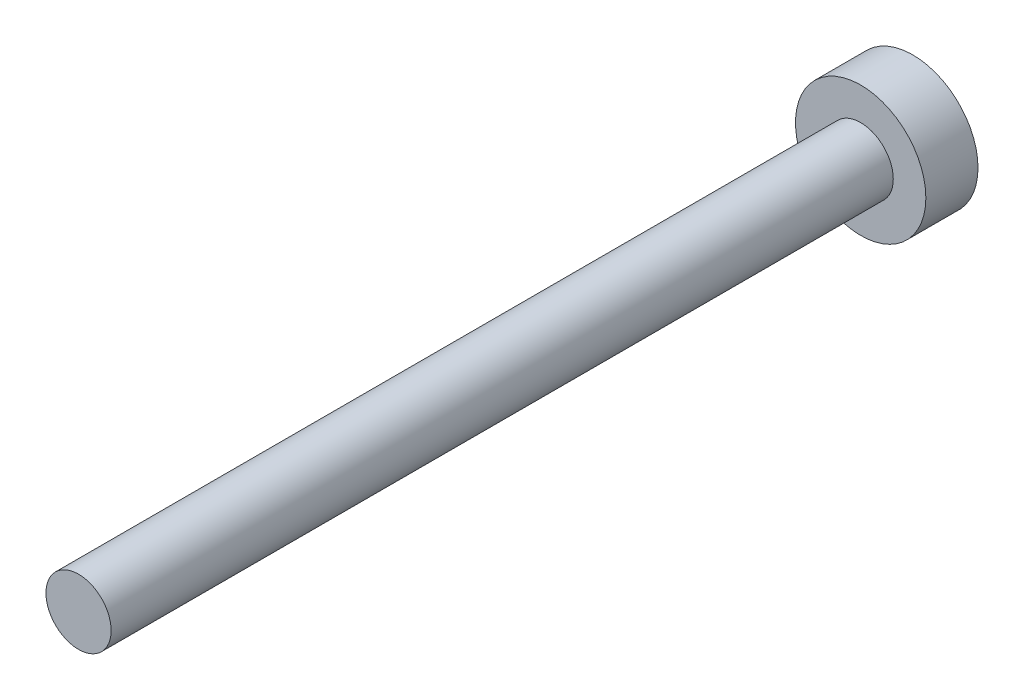
ISO-10303-21;
HEADER;
FILE_DESCRIPTION(('STEP AP214'),'2;1');
FILE_NAME('part.step','',(''),(''),'','','');
FILE_SCHEMA(('AUTOMOTIVE_DESIGN { 1 0 10303 214 1 1 1 1 }'));
ENDSEC;
DATA;
#1=APPLICATION_CONTEXT('core data for automotive mechanical design processes');
#2=APPLICATION_PROTOCOL_DEFINITION('international standard','automotive_design',2000,#1);
#3=PRODUCT_CONTEXT('',#1,'mechanical');
#4=PRODUCT('Part','Part','',(#3));
#5=PRODUCT_RELATED_PRODUCT_CATEGORY('part','',(#4));
#6=PRODUCT_DEFINITION_FORMATION('','',#4);
#7=PRODUCT_DEFINITION_CONTEXT('part definition',#1,'design');
#8=PRODUCT_DEFINITION('design','',#6,#7);
#9=PRODUCT_DEFINITION_SHAPE('','',#8);
#10=(LENGTH_UNIT() NAMED_UNIT(*) SI_UNIT(.MILLI.,.METRE.));
#11=(NAMED_UNIT(*) PLANE_ANGLE_UNIT() SI_UNIT($,.RADIAN.));
#12=(NAMED_UNIT(*) SI_UNIT($,.STERADIAN.) SOLID_ANGLE_UNIT());
#13=UNCERTAINTY_MEASURE_WITH_UNIT(LENGTH_MEASURE(1.E-05),#10,'distance_accuracy_value','');
#14=(GEOMETRIC_REPRESENTATION_CONTEXT(3) GLOBAL_UNCERTAINTY_ASSIGNED_CONTEXT((#13)) GLOBAL_UNIT_ASSIGNED_CONTEXT((#10,
#11,#12)) REPRESENTATION_CONTEXT('',''));
#15=CARTESIAN_POINT('',(0.,0.,0.));
#16=DIRECTION('',(0.,0.,1.));
#17=DIRECTION('',(1.,0.,0.));
#18=AXIS2_PLACEMENT_3D('',#15,#16,#17);
#19=CARTESIAN_POINT('',(0.,0.,6.35));
#20=DIRECTION('',(0.,0.,1.));
#21=DIRECTION('',(1.,0.,0.));
#22=AXIS2_PLACEMENT_3D('',#19,#20,#21);
#23=PLANE('',#22);
#24=CARTESIAN_POINT('',(0.,0.,6.35));
#25=DIRECTION('',(0.,0.,1.));
#26=DIRECTION('',(1.,0.,0.));
#27=AXIS2_PLACEMENT_3D('',#24,#25,#26);
#28=CIRCLE('',#27,7.9375);
#29=CARTESIAN_POINT('',(7.9375,0.,6.35));
#30=VERTEX_POINT('',#29);
#31=EDGE_CURVE('E10',#30,#30,#28,.T.);
#32=ORIENTED_EDGE('',*,*,#31,.T.);
#33=EDGE_LOOP('',(#32));
#34=FACE_BOUND('',#33,.T.);
#35=CARTESIAN_POINT('',(0.,0.,6.35));
#36=DIRECTION('',(0.,0.,1.));
#37=DIRECTION('',(1.,0.,0.));
#38=AXIS2_PLACEMENT_3D('',#35,#36,#37);
#39=CIRCLE('',#38,3.96875);
#40=CARTESIAN_POINT('',(3.96875,0.,6.35));
#41=VERTEX_POINT('',#40);
#42=EDGE_CURVE('E46',#41,#41,#39,.T.);
#43=ORIENTED_EDGE('',*,*,#42,.F.);
#44=EDGE_LOOP('',(#43));
#45=FACE_BOUND('',#44,.T.);
#46=ADVANCED_FACE('F33',(#34,#45),#23,.T.);
#47=CARTESIAN_POINT('',(0.,0.,6.35));
#48=DIRECTION('',(0.,0.,-1.));
#49=DIRECTION('',(-1.,0.,0.));
#50=AXIS2_PLACEMENT_3D('',#47,#48,#49);
#51=CYLINDRICAL_SURFACE('',#50,7.9375);
#52=ORIENTED_EDGE('',*,*,#31,.F.);
#53=EDGE_LOOP('',(#52));
#54=FACE_BOUND('',#53,.T.);
#55=CARTESIAN_POINT('',(0.,0.,0.));
#56=DIRECTION('',(0.,0.,1.));
#57=DIRECTION('',(1.,0.,0.));
#58=AXIS2_PLACEMENT_3D('',#55,#56,#57);
#59=CIRCLE('',#58,7.9375);
#60=CARTESIAN_POINT('',(7.9375,0.,0.));
#61=VERTEX_POINT('',#60);
#62=EDGE_CURVE('E37',#61,#61,#59,.T.);
#63=ORIENTED_EDGE('',*,*,#62,.T.);
#64=EDGE_LOOP('',(#63));
#65=FACE_BOUND('',#64,.T.);
#66=ADVANCED_FACE('F35',(#54,#65),#51,.T.);
#67=CARTESIAN_POINT('',(0.,0.,0.));
#68=DIRECTION('',(0.,0.,1.));
#69=DIRECTION('',(1.,0.,0.));
#70=AXIS2_PLACEMENT_3D('',#67,#68,#69);
#71=PLANE('',#70);
#72=ORIENTED_EDGE('',*,*,#62,.F.);
#73=EDGE_LOOP('',(#72));
#74=FACE_BOUND('',#73,.T.);
#75=ADVANCED_FACE('F57',(#74),#71,.F.);
#76=CARTESIAN_POINT('',(0.,0.,101.6));
#77=DIRECTION('',(0.,0.,-1.));
#78=DIRECTION('',(-1.,0.,0.));
#79=AXIS2_PLACEMENT_3D('',#76,#77,#78);
#80=CYLINDRICAL_SURFACE('',#79,3.96875);
#81=CARTESIAN_POINT('',(0.,0.,101.6));
#82=DIRECTION('',(0.,0.,1.));
#83=DIRECTION('',(1.,0.,0.));
#84=AXIS2_PLACEMENT_3D('',#81,#82,#83);
#85=CIRCLE('',#84,3.96875);
#86=CARTESIAN_POINT('',(3.96875,0.,101.6));
#87=VERTEX_POINT('',#86);
#88=EDGE_CURVE('E44',#87,#87,#85,.T.);
#89=ORIENTED_EDGE('',*,*,#88,.F.);
#90=EDGE_LOOP('',(#89));
#91=FACE_BOUND('',#90,.T.);
#92=ORIENTED_EDGE('',*,*,#42,.T.);
#93=EDGE_LOOP('',(#92));
#94=FACE_BOUND('',#93,.T.);
#95=ADVANCED_FACE('F54',(#91,#94),#80,.T.);
#96=CARTESIAN_POINT('',(0.,0.,101.6));
#97=DIRECTION('',(0.,0.,1.));
#98=DIRECTION('',(1.,0.,0.));
#99=AXIS2_PLACEMENT_3D('',#96,#97,#98);
#100=PLANE('',#99);
#101=ORIENTED_EDGE('',*,*,#88,.T.);
#102=EDGE_LOOP('',(#101));
#103=FACE_BOUND('',#102,.T.);
#104=ADVANCED_FACE('F52',(#103),#100,.T.);
#105=CLOSED_SHELL('',(#46,#66,#75,#95,#104));
#106=MANIFOLD_SOLID_BREP('B2',#105);
#107=ADVANCED_BREP_SHAPE_REPRESENTATION('',(#18,#106),#14);
#108=SHAPE_DEFINITION_REPRESENTATION(#9,#107);
ENDSEC;
END-ISO-10303-21;
